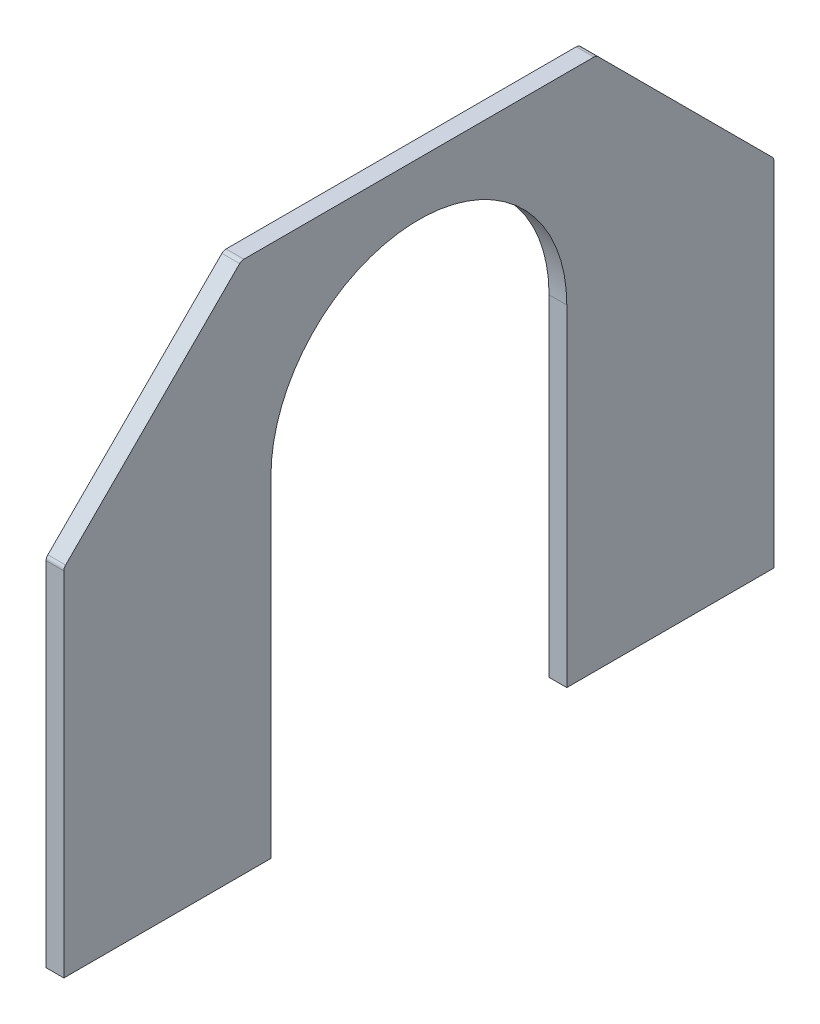
ISO-10303-21;
HEADER;
FILE_DESCRIPTION(('STEP AP214'),'2;1');
FILE_NAME('part.step','',(''),(''),'','','');
FILE_SCHEMA(('AUTOMOTIVE_DESIGN { 1 0 10303 214 1 1 1 1 }'));
ENDSEC;
DATA;
#1=APPLICATION_CONTEXT('core data for automotive mechanical design processes');
#2=APPLICATION_PROTOCOL_DEFINITION('international standard','automotive_design',2000,#1);
#3=PRODUCT_CONTEXT('',#1,'mechanical');
#4=PRODUCT('Part','Part','',(#3));
#5=PRODUCT_RELATED_PRODUCT_CATEGORY('part','',(#4));
#6=PRODUCT_DEFINITION_FORMATION('','',#4);
#7=PRODUCT_DEFINITION_CONTEXT('part definition',#1,'design');
#8=PRODUCT_DEFINITION('design','',#6,#7);
#9=PRODUCT_DEFINITION_SHAPE('','',#8);
#10=(LENGTH_UNIT() NAMED_UNIT(*) SI_UNIT(.MILLI.,.METRE.));
#11=(NAMED_UNIT(*) PLANE_ANGLE_UNIT() SI_UNIT($,.RADIAN.));
#12=(NAMED_UNIT(*) SI_UNIT($,.STERADIAN.) SOLID_ANGLE_UNIT());
#13=UNCERTAINTY_MEASURE_WITH_UNIT(LENGTH_MEASURE(1.E-05),#10,'distance_accuracy_value','');
#14=(GEOMETRIC_REPRESENTATION_CONTEXT(3) GLOBAL_UNCERTAINTY_ASSIGNED_CONTEXT((#13)) GLOBAL_UNIT_ASSIGNED_CONTEXT((#10,
#11,#12)) REPRESENTATION_CONTEXT('',''));
#15=CARTESIAN_POINT('',(0.,0.,0.));
#16=DIRECTION('',(0.,0.,1.));
#17=DIRECTION('',(1.,0.,0.));
#18=AXIS2_PLACEMENT_3D('',#15,#16,#17);
#19=CARTESIAN_POINT('',(-175.5,0.,-12.5));
#20=DIRECTION('',(0.,-1.,0.));
#21=DIRECTION('',(0.,0.,-1.));
#22=AXIS2_PLACEMENT_3D('',#19,#20,#21);
#23=PLANE('',#22);
#24=DIRECTION('',(0.,0.,1.));
#25=VECTOR('',#24,1.);
#26=CARTESIAN_POINT('',(-177.,0.,-12.5));
#27=LINE('',#26,#25);
#28=CARTESIAN_POINT('',(-177.,0.,-30.));
#29=VERTEX_POINT('',#28);
#30=CARTESIAN_POINT('',(-177.,0.,-12.5));
#31=VERTEX_POINT('',#30);
#32=EDGE_CURVE('E169',#29,#31,#27,.T.);
#33=ORIENTED_EDGE('',*,*,#32,.F.);
#34=DIRECTION('',(-1.,0.,0.));
#35=VECTOR('',#34,1.);
#36=CARTESIAN_POINT('',(-175.5,0.,-30.));
#37=LINE('',#36,#35);
#38=CARTESIAN_POINT('',(-175.5,0.,-30.));
#39=VERTEX_POINT('',#38);
#40=EDGE_CURVE('E11',#39,#29,#37,.T.);
#41=ORIENTED_EDGE('',*,*,#40,.F.);
#42=DIRECTION('',(0.,0.,1.));
#43=VECTOR('',#42,1.);
#44=CARTESIAN_POINT('',(-175.5,0.,-12.5));
#45=LINE('',#44,#43);
#46=CARTESIAN_POINT('',(-175.5,0.,-12.5));
#47=VERTEX_POINT('',#46);
#48=EDGE_CURVE('E207',#39,#47,#45,.T.);
#49=ORIENTED_EDGE('',*,*,#48,.T.);
#50=DIRECTION('',(-1.,0.,0.));
#51=VECTOR('',#50,1.);
#52=CARTESIAN_POINT('',(-175.5,0.,-12.5));
#53=LINE('',#52,#51);
#54=EDGE_CURVE('E39',#47,#31,#53,.T.);
#55=ORIENTED_EDGE('',*,*,#54,.T.);
#56=EDGE_LOOP('',(#33,#41,#49,#55));
#57=FACE_BOUND('',#56,.T.);
#58=ADVANCED_FACE('F36',(#57),#23,.T.);
#59=CARTESIAN_POINT('',(-175.5,29.7928932188135,-30.));
#60=DIRECTION('',(0.,0.,-1.));
#61=DIRECTION('',(-1.,0.,0.));
#62=AXIS2_PLACEMENT_3D('',#59,#60,#61);
#63=PLANE('',#62);
#64=DIRECTION('',(0.,-1.,0.));
#65=VECTOR('',#64,1.);
#66=CARTESIAN_POINT('',(-177.,29.7928932188135,-30.));
#67=LINE('',#66,#65);
#68=CARTESIAN_POINT('',(-177.,29.7928932188135,-30.));
#69=VERTEX_POINT('',#68);
#70=EDGE_CURVE('E205',#69,#29,#67,.T.);
#71=ORIENTED_EDGE('',*,*,#70,.F.);
#72=DIRECTION('',(-1.,0.,0.));
#73=VECTOR('',#72,1.);
#74=CARTESIAN_POINT('',(-175.5,29.7928932188135,-30.));
#75=LINE('',#74,#73);
#76=CARTESIAN_POINT('',(-175.5,29.7928932188135,-30.));
#77=VERTEX_POINT('',#76);
#78=EDGE_CURVE('E45',#77,#69,#75,.T.);
#79=ORIENTED_EDGE('',*,*,#78,.F.);
#80=DIRECTION('',(0.,-1.,0.));
#81=VECTOR('',#80,1.);
#82=CARTESIAN_POINT('',(-175.5,29.7928932188135,-30.));
#83=LINE('',#82,#81);
#84=EDGE_CURVE('E159',#77,#39,#83,.T.);
#85=ORIENTED_EDGE('',*,*,#84,.T.);
#86=ORIENTED_EDGE('',*,*,#40,.T.);
#87=EDGE_LOOP('',(#71,#79,#85,#86));
#88=FACE_BOUND('',#87,.T.);
#89=ADVANCED_FACE('F231',(#88),#63,.T.);
#90=CARTESIAN_POINT('',(-175.5,29.7928932188135,-29.5));
#91=DIRECTION('',(-1.,0.,0.));
#92=DIRECTION('',(0.,0.,1.));
#93=AXIS2_PLACEMENT_3D('',#90,#91,#92);
#94=CYLINDRICAL_SURFACE('',#93,0.500000000000001);
#95=CARTESIAN_POINT('',(-177.,29.7928932188135,-29.5));
#96=DIRECTION('',(-1.,0.,0.));
#97=DIRECTION('',(0.,0.,1.));
#98=AXIS2_PLACEMENT_3D('',#95,#96,#97);
#99=CIRCLE('',#98,0.500000000000001);
#100=CARTESIAN_POINT('',(-177.,30.1464466094067,-29.8535533905933));
#101=VERTEX_POINT('',#100);
#102=EDGE_CURVE('E146',#101,#69,#99,.T.);
#103=ORIENTED_EDGE('',*,*,#102,.F.);
#104=DIRECTION('',(-1.,0.,0.));
#105=VECTOR('',#104,1.);
#106=CARTESIAN_POINT('',(-175.5,30.1464466094067,-29.8535533905933));
#107=LINE('',#106,#105);
#108=CARTESIAN_POINT('',(-175.5,30.1464466094067,-29.8535533905933));
#109=VERTEX_POINT('',#108);
#110=EDGE_CURVE('E141',#109,#101,#107,.T.);
#111=ORIENTED_EDGE('',*,*,#110,.F.);
#112=CARTESIAN_POINT('',(-175.5,29.7928932188135,-29.5));
#113=DIRECTION('',(-1.,0.,0.));
#114=DIRECTION('',(0.,0.,1.));
#115=AXIS2_PLACEMENT_3D('',#112,#113,#114);
#116=CIRCLE('',#115,0.500000000000001);
#117=EDGE_CURVE('E144',#109,#77,#116,.T.);
#118=ORIENTED_EDGE('',*,*,#117,.T.);
#119=ORIENTED_EDGE('',*,*,#78,.T.);
#120=EDGE_LOOP('',(#103,#111,#118,#119));
#121=FACE_BOUND('',#120,.T.);
#122=ADVANCED_FACE('F143',(#121),#94,.T.);
#123=CARTESIAN_POINT('',(-175.5,44.8535533905933,-15.1464466094067));
#124=DIRECTION('',(0.,0.707106781186548,-0.707106781186548));
#125=DIRECTION('',(0.,0.707106781186548,0.707106781186548));
#126=AXIS2_PLACEMENT_3D('',#123,#124,#125);
#127=PLANE('',#126);
#128=DIRECTION('',(0.,-0.707106781186547,-0.707106781186547));
#129=VECTOR('',#128,1.);
#130=CARTESIAN_POINT('',(-177.,44.8535533905933,-15.1464466094067));
#131=LINE('',#130,#129);
#132=CARTESIAN_POINT('',(-177.,44.8535533905933,-15.1464466094067));
#133=VERTEX_POINT('',#132);
#134=EDGE_CURVE('E202',#133,#101,#131,.T.);
#135=ORIENTED_EDGE('',*,*,#134,.F.);
#136=DIRECTION('',(-1.,0.,0.));
#137=VECTOR('',#136,1.);
#138=CARTESIAN_POINT('',(-175.5,44.8535533905933,-15.1464466094067));
#139=LINE('',#138,#137);
#140=CARTESIAN_POINT('',(-175.5,44.8535533905933,-15.1464466094067));
#141=VERTEX_POINT('',#140);
#142=EDGE_CURVE('E151',#141,#133,#139,.T.);
#143=ORIENTED_EDGE('',*,*,#142,.F.);
#144=DIRECTION('',(0.,-0.707106781186547,-0.707106781186547));
#145=VECTOR('',#144,1.);
#146=CARTESIAN_POINT('',(-175.5,44.8535533905933,-15.1464466094067));
#147=LINE('',#146,#145);
#148=EDGE_CURVE('E157',#141,#109,#147,.T.);
#149=ORIENTED_EDGE('',*,*,#148,.T.);
#150=ORIENTED_EDGE('',*,*,#110,.T.);
#151=EDGE_LOOP('',(#135,#143,#149,#150));
#152=FACE_BOUND('',#151,.T.);
#153=ADVANCED_FACE('F161',(#152),#127,.T.);
#154=CARTESIAN_POINT('',(-175.5,44.5,-14.7928932188135));
#155=DIRECTION('',(-1.,0.,0.));
#156=DIRECTION('',(0.,0.,1.));
#157=AXIS2_PLACEMENT_3D('',#154,#155,#156);
#158=CYLINDRICAL_SURFACE('',#157,0.499999999999999);
#159=CARTESIAN_POINT('',(-177.,44.5,-14.7928932188135));
#160=DIRECTION('',(-1.,0.,0.));
#161=DIRECTION('',(0.,0.,1.));
#162=AXIS2_PLACEMENT_3D('',#159,#160,#161);
#163=CIRCLE('',#162,0.499999999999999);
#164=CARTESIAN_POINT('',(-177.,45.,-14.7928932188135));
#165=VERTEX_POINT('',#164);
#166=EDGE_CURVE('E199',#165,#133,#163,.T.);
#167=ORIENTED_EDGE('',*,*,#166,.F.);
#168=DIRECTION('',(-1.,0.,0.));
#169=VECTOR('',#168,1.);
#170=CARTESIAN_POINT('',(-175.5,45.,-14.7928932188135));
#171=LINE('',#170,#169);
#172=CARTESIAN_POINT('',(-175.5,45.,-14.7928932188135));
#173=VERTEX_POINT('',#172);
#174=EDGE_CURVE('E211',#173,#165,#171,.T.);
#175=ORIENTED_EDGE('',*,*,#174,.F.);
#176=CARTESIAN_POINT('',(-175.5,44.5,-14.7928932188135));
#177=DIRECTION('',(-1.,0.,0.));
#178=DIRECTION('',(0.,0.,1.));
#179=AXIS2_PLACEMENT_3D('',#176,#177,#178);
#180=CIRCLE('',#179,0.499999999999999);
#181=EDGE_CURVE('E162',#173,#141,#180,.T.);
#182=ORIENTED_EDGE('',*,*,#181,.T.);
#183=ORIENTED_EDGE('',*,*,#142,.T.);
#184=EDGE_LOOP('',(#167,#175,#182,#183));
#185=FACE_BOUND('',#184,.T.);
#186=ADVANCED_FACE('F244',(#185),#158,.T.);
#187=CARTESIAN_POINT('',(-175.5,45.,14.7928932188135));
#188=DIRECTION('',(0.,1.,0.));
#189=DIRECTION('',(0.,0.,1.));
#190=AXIS2_PLACEMENT_3D('',#187,#188,#189);
#191=PLANE('',#190);
#192=DIRECTION('',(0.,0.,-1.));
#193=VECTOR('',#192,1.);
#194=CARTESIAN_POINT('',(-177.,45.,14.7928932188135));
#195=LINE('',#194,#193);
#196=CARTESIAN_POINT('',(-177.,45.,14.7928932188135));
#197=VERTEX_POINT('',#196);
#198=EDGE_CURVE('E196',#197,#165,#195,.T.);
#199=ORIENTED_EDGE('',*,*,#198,.F.);
#200=DIRECTION('',(-1.,0.,0.));
#201=VECTOR('',#200,1.);
#202=CARTESIAN_POINT('',(-175.5,45.,14.7928932188135));
#203=LINE('',#202,#201);
#204=CARTESIAN_POINT('',(-175.5,45.,14.7928932188135));
#205=VERTEX_POINT('',#204);
#206=EDGE_CURVE('E213',#205,#197,#203,.T.);
#207=ORIENTED_EDGE('',*,*,#206,.F.);
#208=DIRECTION('',(0.,0.,-1.));
#209=VECTOR('',#208,1.);
#210=CARTESIAN_POINT('',(-175.5,45.,14.7928932188135));
#211=LINE('',#210,#209);
#212=EDGE_CURVE('E164',#205,#173,#211,.T.);
#213=ORIENTED_EDGE('',*,*,#212,.T.);
#214=ORIENTED_EDGE('',*,*,#174,.T.);
#215=EDGE_LOOP('',(#199,#207,#213,#214));
#216=FACE_BOUND('',#215,.T.);
#217=ADVANCED_FACE('F247',(#216),#191,.T.);
#218=CARTESIAN_POINT('',(-175.5,44.5,14.7928932188135));
#219=DIRECTION('',(-1.,0.,0.));
#220=DIRECTION('',(0.,0.,1.));
#221=AXIS2_PLACEMENT_3D('',#218,#219,#220);
#222=CYLINDRICAL_SURFACE('',#221,0.499999999999998);
#223=CARTESIAN_POINT('',(-177.,44.5,14.7928932188135));
#224=DIRECTION('',(-1.,0.,0.));
#225=DIRECTION('',(0.,0.,1.));
#226=AXIS2_PLACEMENT_3D('',#223,#224,#225);
#227=CIRCLE('',#226,0.499999999999998);
#228=CARTESIAN_POINT('',(-177.,44.8535533905933,15.1464466094067));
#229=VERTEX_POINT('',#228);
#230=EDGE_CURVE('E193',#229,#197,#227,.T.);
#231=ORIENTED_EDGE('',*,*,#230,.F.);
#232=DIRECTION('',(-1.,0.,0.));
#233=VECTOR('',#232,1.);
#234=CARTESIAN_POINT('',(-175.5,44.8535533905933,15.1464466094067));
#235=LINE('',#234,#233);
#236=CARTESIAN_POINT('',(-175.5,44.8535533905933,15.1464466094067));
#237=VERTEX_POINT('',#236);
#238=EDGE_CURVE('E215',#237,#229,#235,.T.);
#239=ORIENTED_EDGE('',*,*,#238,.F.);
#240=CARTESIAN_POINT('',(-175.5,44.5,14.7928932188135));
#241=DIRECTION('',(-1.,0.,0.));
#242=DIRECTION('',(0.,0.,1.));
#243=AXIS2_PLACEMENT_3D('',#240,#241,#242);
#244=CIRCLE('',#243,0.499999999999998);
#245=EDGE_CURVE('E436',#237,#205,#244,.T.);
#246=ORIENTED_EDGE('',*,*,#245,.T.);
#247=ORIENTED_EDGE('',*,*,#206,.T.);
#248=EDGE_LOOP('',(#231,#239,#246,#247));
#249=FACE_BOUND('',#248,.T.);
#250=ADVANCED_FACE('F251',(#249),#222,.T.);
#251=CARTESIAN_POINT('',(-175.5,30.1464466094067,29.8535533905933));
#252=DIRECTION('',(0.,0.707106781186547,0.707106781186548));
#253=DIRECTION('',(0.,-0.707106781186548,0.707106781186547));
#254=AXIS2_PLACEMENT_3D('',#251,#252,#253);
#255=PLANE('',#254);
#256=DIRECTION('',(0.,0.707106781186548,-0.707106781186547));
#257=VECTOR('',#256,1.);
#258=CARTESIAN_POINT('',(-177.,30.1464466094067,29.8535533905933));
#259=LINE('',#258,#257);
#260=CARTESIAN_POINT('',(-177.,30.1464466094067,29.8535533905933));
#261=VERTEX_POINT('',#260);
#262=EDGE_CURVE('E190',#261,#229,#259,.T.);
#263=ORIENTED_EDGE('',*,*,#262,.F.);
#264=DIRECTION('',(-1.,0.,0.));
#265=VECTOR('',#264,1.);
#266=CARTESIAN_POINT('',(-175.5,30.1464466094067,29.8535533905933));
#267=LINE('',#266,#265);
#268=CARTESIAN_POINT('',(-175.5,30.1464466094067,29.8535533905933));
#269=VERTEX_POINT('',#268);
#270=EDGE_CURVE('E217',#269,#261,#267,.T.);
#271=ORIENTED_EDGE('',*,*,#270,.F.);
#272=DIRECTION('',(0.,0.707106781186548,-0.707106781186547));
#273=VECTOR('',#272,1.);
#274=CARTESIAN_POINT('',(-175.5,30.1464466094067,29.8535533905933));
#275=LINE('',#274,#273);
#276=EDGE_CURVE('E429',#269,#237,#275,.T.);
#277=ORIENTED_EDGE('',*,*,#276,.T.);
#278=ORIENTED_EDGE('',*,*,#238,.T.);
#279=EDGE_LOOP('',(#263,#271,#277,#278));
#280=FACE_BOUND('',#279,.T.);
#281=ADVANCED_FACE('F255',(#280),#255,.T.);
#282=CARTESIAN_POINT('',(-175.5,29.7928932188135,29.5));
#283=DIRECTION('',(-1.,0.,0.));
#284=DIRECTION('',(0.,0.,1.));
#285=AXIS2_PLACEMENT_3D('',#282,#283,#284);
#286=CYLINDRICAL_SURFACE('',#285,0.500000000000001);
#287=CARTESIAN_POINT('',(-177.,29.7928932188135,29.5));
#288=DIRECTION('',(-1.,0.,0.));
#289=DIRECTION('',(0.,0.,1.));
#290=AXIS2_PLACEMENT_3D('',#287,#288,#289);
#291=CIRCLE('',#290,0.500000000000001);
#292=CARTESIAN_POINT('',(-177.,29.7928932188135,30.));
#293=VERTEX_POINT('',#292);
#294=EDGE_CURVE('E187',#293,#261,#291,.T.);
#295=ORIENTED_EDGE('',*,*,#294,.F.);
#296=DIRECTION('',(-1.,0.,0.));
#297=VECTOR('',#296,1.);
#298=CARTESIAN_POINT('',(-175.5,29.7928932188135,30.));
#299=LINE('',#298,#297);
#300=CARTESIAN_POINT('',(-175.5,29.7928932188135,30.));
#301=VERTEX_POINT('',#300);
#302=EDGE_CURVE('E219',#301,#293,#299,.T.);
#303=ORIENTED_EDGE('',*,*,#302,.F.);
#304=CARTESIAN_POINT('',(-175.5,29.7928932188135,29.5));
#305=DIRECTION('',(-1.,0.,0.));
#306=DIRECTION('',(0.,0.,1.));
#307=AXIS2_PLACEMENT_3D('',#304,#305,#306);
#308=CIRCLE('',#307,0.500000000000001);
#309=EDGE_CURVE('E425',#301,#269,#308,.T.);
#310=ORIENTED_EDGE('',*,*,#309,.T.);
#311=ORIENTED_EDGE('',*,*,#270,.T.);
#312=EDGE_LOOP('',(#295,#303,#310,#311));
#313=FACE_BOUND('',#312,.T.);
#314=ADVANCED_FACE('F259',(#313),#286,.T.);
#315=CARTESIAN_POINT('',(-175.5,0.,30.));
#316=DIRECTION('',(0.,0.,1.));
#317=DIRECTION('',(0.,-1.,0.));
#318=AXIS2_PLACEMENT_3D('',#315,#316,#317);
#319=PLANE('',#318);
#320=DIRECTION('',(0.,1.,0.));
#321=VECTOR('',#320,1.);
#322=CARTESIAN_POINT('',(-177.,0.,30.));
#323=LINE('',#322,#321);
#324=CARTESIAN_POINT('',(-177.,0.,30.));
#325=VERTEX_POINT('',#324);
#326=EDGE_CURVE('E184',#325,#293,#323,.T.);
#327=ORIENTED_EDGE('',*,*,#326,.F.);
#328=DIRECTION('',(-1.,0.,0.));
#329=VECTOR('',#328,1.);
#330=CARTESIAN_POINT('',(-175.5,0.,30.));
#331=LINE('',#330,#329);
#332=CARTESIAN_POINT('',(-175.5,0.,30.));
#333=VERTEX_POINT('',#332);
#334=EDGE_CURVE('E221',#333,#325,#331,.T.);
#335=ORIENTED_EDGE('',*,*,#334,.F.);
#336=DIRECTION('',(0.,1.,0.));
#337=VECTOR('',#336,1.);
#338=CARTESIAN_POINT('',(-175.5,0.,30.));
#339=LINE('',#338,#337);
#340=EDGE_CURVE('E441',#333,#301,#339,.T.);
#341=ORIENTED_EDGE('',*,*,#340,.T.);
#342=ORIENTED_EDGE('',*,*,#302,.T.);
#343=EDGE_LOOP('',(#327,#335,#341,#342));
#344=FACE_BOUND('',#343,.T.);
#345=ADVANCED_FACE('F263',(#344),#319,.T.);
#346=CARTESIAN_POINT('',(-175.5,0.,30.));
#347=DIRECTION('',(0.,-1.,0.));
#348=DIRECTION('',(0.,0.,-1.));
#349=AXIS2_PLACEMENT_3D('',#346,#347,#348);
#350=PLANE('',#349);
#351=DIRECTION('',(0.,0.,1.));
#352=VECTOR('',#351,1.);
#353=CARTESIAN_POINT('',(-177.,0.,30.));
#354=LINE('',#353,#352);
#355=CARTESIAN_POINT('',(-177.,0.,12.5));
#356=VERTEX_POINT('',#355);
#357=EDGE_CURVE('E181',#356,#325,#354,.T.);
#358=ORIENTED_EDGE('',*,*,#357,.F.);
#359=DIRECTION('',(-1.,0.,0.));
#360=VECTOR('',#359,1.);
#361=CARTESIAN_POINT('',(-175.5,0.,12.5));
#362=LINE('',#361,#360);
#363=CARTESIAN_POINT('',(-175.5,0.,12.5));
#364=VERTEX_POINT('',#363);
#365=EDGE_CURVE('E223',#364,#356,#362,.T.);
#366=ORIENTED_EDGE('',*,*,#365,.F.);
#367=DIRECTION('',(0.,0.,1.));
#368=VECTOR('',#367,1.);
#369=CARTESIAN_POINT('',(-175.5,0.,30.));
#370=LINE('',#369,#368);
#371=EDGE_CURVE('E418',#364,#333,#370,.T.);
#372=ORIENTED_EDGE('',*,*,#371,.T.);
#373=ORIENTED_EDGE('',*,*,#334,.T.);
#374=EDGE_LOOP('',(#358,#366,#372,#373));
#375=FACE_BOUND('',#374,.T.);
#376=ADVANCED_FACE('F267',(#375),#350,.T.);
#377=CARTESIAN_POINT('',(-175.5,28.,12.5));
#378=DIRECTION('',(0.,0.,-1.));
#379=DIRECTION('',(-1.,0.,0.));
#380=AXIS2_PLACEMENT_3D('',#377,#378,#379);
#381=PLANE('',#380);
#382=DIRECTION('',(0.,-1.,0.));
#383=VECTOR('',#382,1.);
#384=CARTESIAN_POINT('',(-177.,28.,12.5));
#385=LINE('',#384,#383);
#386=CARTESIAN_POINT('',(-177.,28.,12.5));
#387=VERTEX_POINT('',#386);
#388=EDGE_CURVE('E178',#387,#356,#385,.T.);
#389=ORIENTED_EDGE('',*,*,#388,.F.);
#390=DIRECTION('',(-1.,0.,0.));
#391=VECTOR('',#390,1.);
#392=CARTESIAN_POINT('',(-175.5,28.,12.5));
#393=LINE('',#392,#391);
#394=CARTESIAN_POINT('',(-175.5,28.,12.5));
#395=VERTEX_POINT('',#394);
#396=EDGE_CURVE('E225',#395,#387,#393,.T.);
#397=ORIENTED_EDGE('',*,*,#396,.F.);
#398=DIRECTION('',(0.,-1.,0.));
#399=VECTOR('',#398,1.);
#400=CARTESIAN_POINT('',(-175.5,28.,12.5));
#401=LINE('',#400,#399);
#402=EDGE_CURVE('E414',#395,#364,#401,.T.);
#403=ORIENTED_EDGE('',*,*,#402,.T.);
#404=ORIENTED_EDGE('',*,*,#365,.T.);
#405=EDGE_LOOP('',(#389,#397,#403,#404));
#406=FACE_BOUND('',#405,.T.);
#407=ADVANCED_FACE('F271',(#406),#381,.T.);
#408=CARTESIAN_POINT('',(-175.5,28.,0.));
#409=DIRECTION('',(-1.,0.,0.));
#410=DIRECTION('',(0.,0.,1.));
#411=AXIS2_PLACEMENT_3D('',#408,#409,#410);
#412=CYLINDRICAL_SURFACE('',#411,12.5);
#413=CARTESIAN_POINT('',(-177.,28.,0.));
#414=DIRECTION('',(1.,0.,0.));
#415=DIRECTION('',(0.,0.,1.));
#416=AXIS2_PLACEMENT_3D('',#413,#414,#415);
#417=CIRCLE('',#416,12.5);
#418=CARTESIAN_POINT('',(-177.,28.,-12.5));
#419=VERTEX_POINT('',#418);
#420=EDGE_CURVE('E175',#419,#387,#417,.T.);
#421=ORIENTED_EDGE('',*,*,#420,.F.);
#422=DIRECTION('',(-1.,0.,0.));
#423=VECTOR('',#422,1.);
#424=CARTESIAN_POINT('',(-175.5,28.,-12.5));
#425=LINE('',#424,#423);
#426=CARTESIAN_POINT('',(-175.5,28.,-12.5));
#427=VERTEX_POINT('',#426);
#428=EDGE_CURVE('E226',#427,#419,#425,.T.);
#429=ORIENTED_EDGE('',*,*,#428,.F.);
#430=CARTESIAN_POINT('',(-175.5,28.,0.));
#431=DIRECTION('',(1.,0.,0.));
#432=DIRECTION('',(0.,0.,1.));
#433=AXIS2_PLACEMENT_3D('',#430,#431,#432);
#434=CIRCLE('',#433,12.5);
#435=EDGE_CURVE('E445',#427,#395,#434,.T.);
#436=ORIENTED_EDGE('',*,*,#435,.T.);
#437=ORIENTED_EDGE('',*,*,#396,.T.);
#438=EDGE_LOOP('',(#421,#429,#436,#437));
#439=FACE_BOUND('',#438,.T.);
#440=ADVANCED_FACE('F275',(#439),#412,.F.);
#441=CARTESIAN_POINT('',(-175.5,28.,-12.5));
#442=DIRECTION('',(0.,0.,1.));
#443=DIRECTION('',(1.,0.,0.));
#444=AXIS2_PLACEMENT_3D('',#441,#442,#443);
#445=PLANE('',#444);
#446=DIRECTION('',(0.,1.,0.));
#447=VECTOR('',#446,1.);
#448=CARTESIAN_POINT('',(-177.,28.,-12.5));
#449=LINE('',#448,#447);
#450=EDGE_CURVE('E172',#31,#419,#449,.T.);
#451=ORIENTED_EDGE('',*,*,#450,.F.);
#452=ORIENTED_EDGE('',*,*,#54,.F.);
#453=DIRECTION('',(0.,1.,0.));
#454=VECTOR('',#453,1.);
#455=CARTESIAN_POINT('',(-175.5,28.,-12.5));
#456=LINE('',#455,#454);
#457=EDGE_CURVE('E447',#47,#427,#456,.T.);
#458=ORIENTED_EDGE('',*,*,#457,.T.);
#459=ORIENTED_EDGE('',*,*,#428,.T.);
#460=EDGE_LOOP('',(#451,#452,#458,#459));
#461=FACE_BOUND('',#460,.T.);
#462=ADVANCED_FACE('F228',(#461),#445,.T.);
#463=CARTESIAN_POINT('',(-175.5,29.7928932188135,-29.5));
#464=DIRECTION('',(-1.,0.,0.));
#465=DIRECTION('',(0.,0.,1.));
#466=AXIS2_PLACEMENT_3D('',#463,#464,#465);
#467=PLANE('',#466);
#468=ORIENTED_EDGE('',*,*,#48,.F.);
#469=ORIENTED_EDGE('',*,*,#84,.F.);
#470=ORIENTED_EDGE('',*,*,#117,.F.);
#471=ORIENTED_EDGE('',*,*,#148,.F.);
#472=ORIENTED_EDGE('',*,*,#181,.F.);
#473=ORIENTED_EDGE('',*,*,#212,.F.);
#474=ORIENTED_EDGE('',*,*,#245,.F.);
#475=ORIENTED_EDGE('',*,*,#276,.F.);
#476=ORIENTED_EDGE('',*,*,#309,.F.);
#477=ORIENTED_EDGE('',*,*,#340,.F.);
#478=ORIENTED_EDGE('',*,*,#371,.F.);
#479=ORIENTED_EDGE('',*,*,#402,.F.);
#480=ORIENTED_EDGE('',*,*,#435,.F.);
#481=ORIENTED_EDGE('',*,*,#457,.F.);
#482=EDGE_LOOP('',(#468,#469,#470,#471,#472,#473,#474,#475,#476,#477,#478,#479,#480,#481));
#483=FACE_BOUND('',#482,.T.);
#484=ADVANCED_FACE('F155',(#483),#467,.F.);
#485=CARTESIAN_POINT('',(-177.,29.7928932188135,-29.5));
#486=DIRECTION('',(-1.,0.,0.));
#487=DIRECTION('',(0.,0.,1.));
#488=AXIS2_PLACEMENT_3D('',#485,#486,#487);
#489=PLANE('',#488);
#490=ORIENTED_EDGE('',*,*,#32,.T.);
#491=ORIENTED_EDGE('',*,*,#450,.T.);
#492=ORIENTED_EDGE('',*,*,#420,.T.);
#493=ORIENTED_EDGE('',*,*,#388,.T.);
#494=ORIENTED_EDGE('',*,*,#357,.T.);
#495=ORIENTED_EDGE('',*,*,#326,.T.);
#496=ORIENTED_EDGE('',*,*,#294,.T.);
#497=ORIENTED_EDGE('',*,*,#262,.T.);
#498=ORIENTED_EDGE('',*,*,#230,.T.);
#499=ORIENTED_EDGE('',*,*,#198,.T.);
#500=ORIENTED_EDGE('',*,*,#166,.T.);
#501=ORIENTED_EDGE('',*,*,#134,.T.);
#502=ORIENTED_EDGE('',*,*,#102,.T.);
#503=ORIENTED_EDGE('',*,*,#70,.T.);
#504=EDGE_LOOP('',(#490,#491,#492,#493,#494,#495,#496,#497,#498,#499,#500,#501,#502,#503));
#505=FACE_BOUND('',#504,.T.);
#506=ADVANCED_FACE('F230',(#505),#489,.T.);
#507=CLOSED_SHELL('',(#58,#89,#122,#153,#186,#217,#250,#281,#314,#345,#376,#407,#440,#462,#484,#506));
#508=MANIFOLD_SOLID_BREP('B2',#507);
#509=ADVANCED_BREP_SHAPE_REPRESENTATION('',(#18,#508),#14);
#510=SHAPE_DEFINITION_REPRESENTATION(#9,#509);
ENDSEC;
END-ISO-10303-21;
